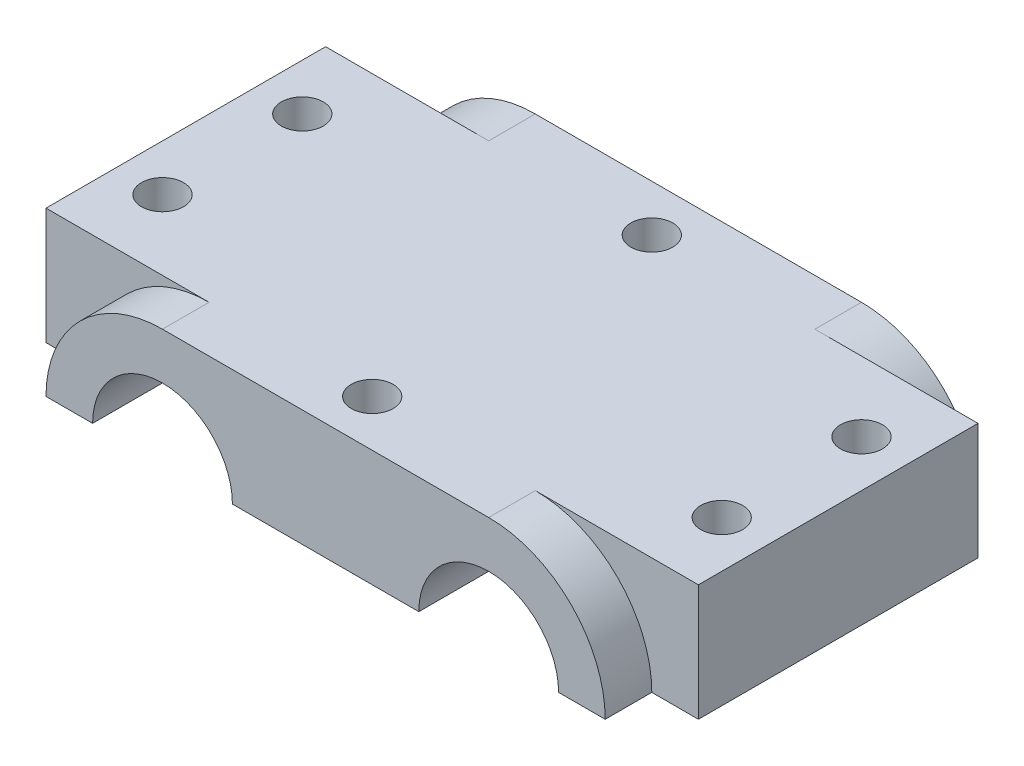
ISO-10303-21;
HEADER;
FILE_DESCRIPTION(('STEP AP214'),'2;1');
FILE_NAME('part.step','',(''),(''),'','','');
FILE_SCHEMA(('AUTOMOTIVE_DESIGN { 1 0 10303 214 1 1 1 1 }'));
ENDSEC;
DATA;
#1=APPLICATION_CONTEXT('core data for automotive mechanical design processes');
#2=APPLICATION_PROTOCOL_DEFINITION('international standard','automotive_design',2000,#1);
#3=PRODUCT_CONTEXT('',#1,'mechanical');
#4=PRODUCT('Part','Part','',(#3));
#5=PRODUCT_RELATED_PRODUCT_CATEGORY('part','',(#4));
#6=PRODUCT_DEFINITION_FORMATION('','',#4);
#7=PRODUCT_DEFINITION_CONTEXT('part definition',#1,'design');
#8=PRODUCT_DEFINITION('design','',#6,#7);
#9=PRODUCT_DEFINITION_SHAPE('','',#8);
#10=(LENGTH_UNIT() NAMED_UNIT(*) SI_UNIT(.MILLI.,.METRE.));
#11=(NAMED_UNIT(*) PLANE_ANGLE_UNIT() SI_UNIT($,.RADIAN.));
#12=(NAMED_UNIT(*) SI_UNIT($,.STERADIAN.) SOLID_ANGLE_UNIT());
#13=UNCERTAINTY_MEASURE_WITH_UNIT(LENGTH_MEASURE(1.E-05),#10,'distance_accuracy_value','');
#14=(GEOMETRIC_REPRESENTATION_CONTEXT(3) GLOBAL_UNCERTAINTY_ASSIGNED_CONTEXT((#13)) GLOBAL_UNIT_ASSIGNED_CONTEXT((#10,
#11,#12)) REPRESENTATION_CONTEXT('',''));
#15=CARTESIAN_POINT('',(0.,0.,0.));
#16=DIRECTION('',(0.,0.,1.));
#17=DIRECTION('',(1.,0.,0.));
#18=AXIS2_PLACEMENT_3D('',#15,#16,#17);
#19=CARTESIAN_POINT('',(0.,0.,15.));
#20=DIRECTION('',(0.,0.,1.));
#21=DIRECTION('',(1.,0.,0.));
#22=AXIS2_PLACEMENT_3D('',#19,#20,#21);
#23=PLANE('',#22);
#24=DIRECTION('',(1.,0.,0.));
#25=VECTOR('',#24,1.);
#26=CARTESIAN_POINT('',(0.,12.5,15.));
#27=LINE('',#26,#25);
#28=CARTESIAN_POINT('',(52.5,12.5,15.));
#29=VERTEX_POINT('',#28);
#30=CARTESIAN_POINT('',(70.,12.5,15.));
#31=VERTEX_POINT('',#30);
#32=EDGE_CURVE('E69',#29,#31,#27,.T.);
#33=ORIENTED_EDGE('',*,*,#32,.F.);
#34=CARTESIAN_POINT('',(52.5,0.,15.));
#35=DIRECTION('',(0.,0.,1.));
#36=DIRECTION('',(1.,0.,0.));
#37=AXIS2_PLACEMENT_3D('',#34,#35,#36);
#38=CIRCLE('',#37,12.5);
#39=CARTESIAN_POINT('',(65.,0.,15.));
#40=VERTEX_POINT('',#39);
#41=EDGE_CURVE('E262',#29,#40,#38,.F.);
#42=ORIENTED_EDGE('',*,*,#41,.T.);
#43=DIRECTION('',(-1.,0.,0.));
#44=VECTOR('',#43,1.);
#45=CARTESIAN_POINT('',(0.,0.,15.));
#46=LINE('',#45,#44);
#47=CARTESIAN_POINT('',(70.,0.,15.));
#48=VERTEX_POINT('',#47);
#49=EDGE_CURVE('E266',#48,#40,#46,.T.);
#50=ORIENTED_EDGE('',*,*,#49,.F.);
#51=DIRECTION('',(0.,1.,0.));
#52=VECTOR('',#51,1.);
#53=CARTESIAN_POINT('',(70.,0.,15.));
#54=LINE('',#53,#52);
#55=EDGE_CURVE('E269',#48,#31,#54,.T.);
#56=ORIENTED_EDGE('',*,*,#55,.T.);
#57=EDGE_LOOP('',(#33,#42,#50,#56));
#58=FACE_BOUND('',#57,.T.);
#59=ADVANCED_FACE('F43',(#58),#23,.T.);
#60=DIRECTION('',(1.,0.,0.));
#61=VECTOR('',#60,1.);
#62=CARTESIAN_POINT('',(0.,0.,15.));
#63=LINE('',#62,#61);
#64=CARTESIAN_POINT('',(0.,0.,15.));
#65=VERTEX_POINT('',#64);
#66=CARTESIAN_POINT('',(5.,0.,15.));
#67=VERTEX_POINT('',#66);
#68=EDGE_CURVE('E61',#65,#67,#63,.T.);
#69=ORIENTED_EDGE('',*,*,#68,.T.);
#70=CARTESIAN_POINT('',(17.5,0.,15.));
#71=DIRECTION('',(0.,0.,1.));
#72=DIRECTION('',(1.,0.,0.));
#73=AXIS2_PLACEMENT_3D('',#70,#71,#72);
#74=CIRCLE('',#73,12.5);
#75=CARTESIAN_POINT('',(17.5,12.5,15.));
#76=VERTEX_POINT('',#75);
#77=EDGE_CURVE('E259',#67,#76,#74,.F.);
#78=ORIENTED_EDGE('',*,*,#77,.T.);
#79=CARTESIAN_POINT('',(0.,12.5,15.));
#80=VERTEX_POINT('',#79);
#81=EDGE_CURVE('E273',#80,#76,#27,.T.);
#82=ORIENTED_EDGE('',*,*,#81,.F.);
#83=DIRECTION('',(0.,1.,0.));
#84=VECTOR('',#83,1.);
#85=CARTESIAN_POINT('',(0.,0.,15.));
#86=LINE('',#85,#84);
#87=EDGE_CURVE('E277',#65,#80,#86,.T.);
#88=ORIENTED_EDGE('',*,*,#87,.F.);
#89=EDGE_LOOP('',(#69,#78,#82,#88));
#90=FACE_BOUND('',#89,.T.);
#91=ADVANCED_FACE('F397',(#90),#23,.T.);
#92=CARTESIAN_POINT('',(0.,0.,-15.));
#93=DIRECTION('',(0.,0.,1.));
#94=DIRECTION('',(1.,0.,0.));
#95=AXIS2_PLACEMENT_3D('',#92,#93,#94);
#96=PLANE('',#95);
#97=CARTESIAN_POINT('',(52.5,0.,-15.));
#98=DIRECTION('',(0.,0.,1.));
#99=DIRECTION('',(1.,0.,0.));
#100=AXIS2_PLACEMENT_3D('',#97,#98,#99);
#101=CIRCLE('',#100,12.5);
#102=CARTESIAN_POINT('',(52.5,12.5,-15.));
#103=VERTEX_POINT('',#102);
#104=CARTESIAN_POINT('',(65.,0.,-15.));
#105=VERTEX_POINT('',#104);
#106=EDGE_CURVE('E11',#103,#105,#101,.F.);
#107=ORIENTED_EDGE('',*,*,#106,.F.);
#108=DIRECTION('',(1.,0.,0.));
#109=VECTOR('',#108,1.);
#110=CARTESIAN_POINT('',(0.,12.5,-15.));
#111=LINE('',#110,#109);
#112=CARTESIAN_POINT('',(70.,12.5,-15.));
#113=VERTEX_POINT('',#112);
#114=EDGE_CURVE('E291',#103,#113,#111,.T.);
#115=ORIENTED_EDGE('',*,*,#114,.T.);
#116=DIRECTION('',(0.,1.,0.));
#117=VECTOR('',#116,1.);
#118=CARTESIAN_POINT('',(70.,0.,-15.));
#119=LINE('',#118,#117);
#120=CARTESIAN_POINT('',(70.,0.,-15.));
#121=VERTEX_POINT('',#120);
#122=EDGE_CURVE('E287',#121,#113,#119,.T.);
#123=ORIENTED_EDGE('',*,*,#122,.F.);
#124=DIRECTION('',(-1.,0.,0.));
#125=VECTOR('',#124,1.);
#126=CARTESIAN_POINT('',(0.,0.,-15.));
#127=LINE('',#126,#125);
#128=EDGE_CURVE('E265',#121,#105,#127,.T.);
#129=ORIENTED_EDGE('',*,*,#128,.T.);
#130=EDGE_LOOP('',(#107,#115,#123,#129));
#131=FACE_BOUND('',#130,.T.);
#132=ADVANCED_FACE('F402',(#131),#96,.F.);
#133=CARTESIAN_POINT('',(17.5,0.,-15.));
#134=DIRECTION('',(0.,0.,1.));
#135=DIRECTION('',(1.,0.,0.));
#136=AXIS2_PLACEMENT_3D('',#133,#134,#135);
#137=CIRCLE('',#136,12.5);
#138=CARTESIAN_POINT('',(5.,0.,-15.));
#139=VERTEX_POINT('',#138);
#140=CARTESIAN_POINT('',(17.5,12.5,-15.));
#141=VERTEX_POINT('',#140);
#142=EDGE_CURVE('E53',#139,#141,#137,.F.);
#143=ORIENTED_EDGE('',*,*,#142,.F.);
#144=DIRECTION('',(1.,0.,0.));
#145=VECTOR('',#144,1.);
#146=CARTESIAN_POINT('',(0.,0.,-15.));
#147=LINE('',#146,#145);
#148=CARTESIAN_POINT('',(0.,0.,-15.));
#149=VERTEX_POINT('',#148);
#150=EDGE_CURVE('E270',#149,#139,#147,.T.);
#151=ORIENTED_EDGE('',*,*,#150,.F.);
#152=DIRECTION('',(0.,1.,0.));
#153=VECTOR('',#152,1.);
#154=CARTESIAN_POINT('',(0.,0.,-15.));
#155=LINE('',#154,#153);
#156=CARTESIAN_POINT('',(0.,12.5,-15.));
#157=VERTEX_POINT('',#156);
#158=EDGE_CURVE('E296',#149,#157,#155,.T.);
#159=ORIENTED_EDGE('',*,*,#158,.T.);
#160=EDGE_CURVE('E292',#157,#141,#111,.T.);
#161=ORIENTED_EDGE('',*,*,#160,.T.);
#162=EDGE_LOOP('',(#143,#151,#159,#161));
#163=FACE_BOUND('',#162,.T.);
#164=ADVANCED_FACE('F409',(#163),#96,.F.);
#165=CARTESIAN_POINT('',(52.5,0.,15.));
#166=DIRECTION('',(0.,0.,-1.));
#167=DIRECTION('',(-1.,0.,0.));
#168=AXIS2_PLACEMENT_3D('',#165,#166,#167);
#169=CYLINDRICAL_SURFACE('',#168,7.5);
#170=DIRECTION('',(0.,0.,-1.));
#171=VECTOR('',#170,1.);
#172=CARTESIAN_POINT('',(45.,0.,15.));
#173=LINE('',#172,#171);
#174=CARTESIAN_POINT('',(45.,0.,20.));
#175=VERTEX_POINT('',#174);
#176=CARTESIAN_POINT('',(45.,0.,-20.));
#177=VERTEX_POINT('',#176);
#178=EDGE_CURVE('E283',#175,#177,#173,.T.);
#179=ORIENTED_EDGE('',*,*,#178,.T.);
#180=CARTESIAN_POINT('',(52.5,0.,-20.));
#181=DIRECTION('',(0.,0.,1.));
#182=DIRECTION('',(1.,0.,0.));
#183=AXIS2_PLACEMENT_3D('',#180,#181,#182);
#184=CIRCLE('',#183,7.5);
#185=CARTESIAN_POINT('',(60.,0.,-20.));
#186=VERTEX_POINT('',#185);
#187=EDGE_CURVE('E163',#186,#177,#184,.T.);
#188=ORIENTED_EDGE('',*,*,#187,.F.);
#189=DIRECTION('',(0.,0.,-1.));
#190=VECTOR('',#189,1.);
#191=CARTESIAN_POINT('',(60.,0.,15.));
#192=LINE('',#191,#190);
#193=CARTESIAN_POINT('',(60.,0.,20.));
#194=VERTEX_POINT('',#193);
#195=EDGE_CURVE('E159',#194,#186,#192,.T.);
#196=ORIENTED_EDGE('',*,*,#195,.F.);
#197=CARTESIAN_POINT('',(52.5,0.,20.));
#198=DIRECTION('',(0.,0.,1.));
#199=DIRECTION('',(1.,0.,0.));
#200=AXIS2_PLACEMENT_3D('',#197,#198,#199);
#201=CIRCLE('',#200,7.5);
#202=EDGE_CURVE('E161',#194,#175,#201,.T.);
#203=ORIENTED_EDGE('',*,*,#202,.T.);
#204=EDGE_LOOP('',(#179,#188,#196,#203));
#205=FACE_BOUND('',#204,.T.);
#206=ADVANCED_FACE('F45',(#205),#169,.F.);
#207=CARTESIAN_POINT('',(0.,0.,15.));
#208=DIRECTION('',(0.,-1.,0.));
#209=DIRECTION('',(0.,0.,-1.));
#210=AXIS2_PLACEMENT_3D('',#207,#208,#209);
#211=PLANE('',#210);
#212=CARTESIAN_POINT('',(65.,0.,7.50000000000001));
#213=DIRECTION('',(0.,1.,0.));
#214=DIRECTION('',(0.,0.,1.));
#215=AXIS2_PLACEMENT_3D('',#212,#213,#214);
#216=CIRCLE('',#215,2.25);
#217=CARTESIAN_POINT('',(65.,0.,9.75));
#218=VERTEX_POINT('',#217);
#219=EDGE_CURVE('E352',#218,#218,#216,.T.);
#220=ORIENTED_EDGE('',*,*,#219,.T.);
#221=EDGE_LOOP('',(#220));
#222=FACE_BOUND('',#221,.T.);
#223=CARTESIAN_POINT('',(65.,0.,-7.50000000000001));
#224=DIRECTION('',(0.,1.,0.));
#225=DIRECTION('',(0.,0.,-1.));
#226=AXIS2_PLACEMENT_3D('',#223,#224,#225);
#227=CIRCLE('',#226,2.25);
#228=CARTESIAN_POINT('',(65.,0.,-9.75));
#229=VERTEX_POINT('',#228);
#230=EDGE_CURVE('E361',#229,#229,#227,.T.);
#231=ORIENTED_EDGE('',*,*,#230,.T.);
#232=EDGE_LOOP('',(#231));
#233=FACE_BOUND('',#232,.T.);
#234=DIRECTION('',(0.,0.,-1.));
#235=VECTOR('',#234,1.);
#236=CARTESIAN_POINT('',(65.,0.,20.));
#237=LINE('',#236,#235);
#238=CARTESIAN_POINT('',(65.,0.,-20.));
#239=VERTEX_POINT('',#238);
#240=EDGE_CURVE('E256',#105,#239,#237,.T.);
#241=ORIENTED_EDGE('',*,*,#240,.F.);
#242=ORIENTED_EDGE('',*,*,#128,.F.);
#243=DIRECTION('',(0.,0.,-1.));
#244=VECTOR('',#243,1.);
#245=CARTESIAN_POINT('',(70.,0.,15.));
#246=LINE('',#245,#244);
#247=EDGE_CURVE('E169',#48,#121,#246,.T.);
#248=ORIENTED_EDGE('',*,*,#247,.F.);
#249=ORIENTED_EDGE('',*,*,#49,.T.);
#250=CARTESIAN_POINT('',(65.,0.,20.));
#251=VERTEX_POINT('',#250);
#252=EDGE_CURVE('E186',#251,#40,#237,.T.);
#253=ORIENTED_EDGE('',*,*,#252,.F.);
#254=DIRECTION('',(-1.,0.,0.));
#255=VECTOR('',#254,1.);
#256=CARTESIAN_POINT('',(0.,0.,20.));
#257=LINE('',#256,#255);
#258=EDGE_CURVE('E175',#251,#194,#257,.T.);
#259=ORIENTED_EDGE('',*,*,#258,.T.);
#260=ORIENTED_EDGE('',*,*,#195,.T.);
#261=DIRECTION('',(-1.,0.,0.));
#262=VECTOR('',#261,1.);
#263=CARTESIAN_POINT('',(0.,0.,-20.));
#264=LINE('',#263,#262);
#265=EDGE_CURVE('E216',#239,#186,#264,.T.);
#266=ORIENTED_EDGE('',*,*,#265,.F.);
#267=EDGE_LOOP('',(#241,#242,#248,#249,#253,#259,#260,#266));
#268=FACE_BOUND('',#267,.T.);
#269=ADVANCED_FACE('F183',(#222,#233,#268),#211,.T.);
#270=CARTESIAN_POINT('',(70.,0.,15.));
#271=DIRECTION('',(-1.,0.,0.));
#272=DIRECTION('',(0.,0.,1.));
#273=AXIS2_PLACEMENT_3D('',#270,#271,#272);
#274=PLANE('',#273);
#275=ORIENTED_EDGE('',*,*,#122,.T.);
#276=DIRECTION('',(0.,0.,-1.));
#277=VECTOR('',#276,1.);
#278=CARTESIAN_POINT('',(70.,12.5,15.));
#279=LINE('',#278,#277);
#280=EDGE_CURVE('E317',#31,#113,#279,.T.);
#281=ORIENTED_EDGE('',*,*,#280,.F.);
#282=ORIENTED_EDGE('',*,*,#55,.F.);
#283=ORIENTED_EDGE('',*,*,#247,.T.);
#284=EDGE_LOOP('',(#275,#281,#282,#283));
#285=FACE_BOUND('',#284,.T.);
#286=ADVANCED_FACE('F429',(#285),#274,.F.);
#287=CARTESIAN_POINT('',(0.,12.5,15.));
#288=DIRECTION('',(0.,1.,0.));
#289=DIRECTION('',(0.,0.,1.));
#290=AXIS2_PLACEMENT_3D('',#287,#288,#289);
#291=PLANE('',#290);
#292=CARTESIAN_POINT('',(35.,12.5,-15.));
#293=DIRECTION('',(0.,1.,0.));
#294=DIRECTION('',(0.,0.,1.));
#295=AXIS2_PLACEMENT_3D('',#292,#293,#294);
#296=CIRCLE('',#295,2.25);
#297=CARTESIAN_POINT('',(35.,12.5,-12.75));
#298=VERTEX_POINT('',#297);
#299=EDGE_CURVE('E341',#298,#298,#296,.T.);
#300=ORIENTED_EDGE('',*,*,#299,.F.);
#301=EDGE_LOOP('',(#300));
#302=FACE_BOUND('',#301,.T.);
#303=CARTESIAN_POINT('',(5.,12.5,7.50000000000001));
#304=DIRECTION('',(0.,1.,0.));
#305=DIRECTION('',(0.,0.,1.));
#306=AXIS2_PLACEMENT_3D('',#303,#304,#305);
#307=CIRCLE('',#306,2.25);
#308=CARTESIAN_POINT('',(5.,12.5,9.75000000000001));
#309=VERTEX_POINT('',#308);
#310=EDGE_CURVE('E327',#309,#309,#307,.T.);
#311=ORIENTED_EDGE('',*,*,#310,.F.);
#312=EDGE_LOOP('',(#311));
#313=FACE_BOUND('',#312,.T.);
#314=CARTESIAN_POINT('',(65.,12.5,7.50000000000001));
#315=DIRECTION('',(0.,1.,0.));
#316=DIRECTION('',(0.,0.,1.));
#317=AXIS2_PLACEMENT_3D('',#314,#315,#316);
#318=CIRCLE('',#317,2.25);
#319=CARTESIAN_POINT('',(65.,12.5,9.75));
#320=VERTEX_POINT('',#319);
#321=EDGE_CURVE('E47',#320,#320,#318,.T.);
#322=ORIENTED_EDGE('',*,*,#321,.F.);
#323=EDGE_LOOP('',(#322));
#324=FACE_BOUND('',#323,.T.);
#325=CARTESIAN_POINT('',(35.,12.5,15.));
#326=DIRECTION('',(0.,1.,0.));
#327=DIRECTION('',(0.,0.,1.));
#328=AXIS2_PLACEMENT_3D('',#325,#326,#327);
#329=CIRCLE('',#328,2.25);
#330=CARTESIAN_POINT('',(35.,12.5,17.25));
#331=VERTEX_POINT('',#330);
#332=EDGE_CURVE('E347',#331,#331,#329,.T.);
#333=ORIENTED_EDGE('',*,*,#332,.F.);
#334=EDGE_LOOP('',(#333));
#335=FACE_BOUND('',#334,.T.);
#336=CARTESIAN_POINT('',(65.,12.5,-7.50000000000001));
#337=DIRECTION('',(0.,1.,0.));
#338=DIRECTION('',(0.,0.,1.));
#339=AXIS2_PLACEMENT_3D('',#336,#337,#338);
#340=CIRCLE('',#339,2.25);
#341=CARTESIAN_POINT('',(65.,12.5,-5.25000000000001));
#342=VERTEX_POINT('',#341);
#343=EDGE_CURVE('E324',#342,#342,#340,.T.);
#344=ORIENTED_EDGE('',*,*,#343,.F.);
#345=EDGE_LOOP('',(#344));
#346=FACE_BOUND('',#345,.T.);
#347=CARTESIAN_POINT('',(5.,12.5,-7.5));
#348=DIRECTION('',(0.,1.,0.));
#349=DIRECTION('',(0.,0.,1.));
#350=AXIS2_PLACEMENT_3D('',#347,#348,#349);
#351=CIRCLE('',#350,2.25);
#352=CARTESIAN_POINT('',(5.,12.5,-5.25));
#353=VERTEX_POINT('',#352);
#354=EDGE_CURVE('E335',#353,#353,#351,.T.);
#355=ORIENTED_EDGE('',*,*,#354,.F.);
#356=EDGE_LOOP('',(#355));
#357=FACE_BOUND('',#356,.T.);
#358=ORIENTED_EDGE('',*,*,#81,.T.);
#359=DIRECTION('',(0.,0.,-1.));
#360=VECTOR('',#359,1.);
#361=CARTESIAN_POINT('',(17.5,12.5,20.));
#362=LINE('',#361,#360);
#363=CARTESIAN_POINT('',(17.5,12.5,20.));
#364=VERTEX_POINT('',#363);
#365=EDGE_CURVE('E247',#364,#76,#362,.T.);
#366=ORIENTED_EDGE('',*,*,#365,.F.);
#367=DIRECTION('',(1.,0.,0.));
#368=VECTOR('',#367,1.);
#369=CARTESIAN_POINT('',(0.,12.5,20.));
#370=LINE('',#369,#368);
#371=CARTESIAN_POINT('',(52.5,12.5,20.));
#372=VERTEX_POINT('',#371);
#373=EDGE_CURVE('E193',#364,#372,#370,.T.);
#374=ORIENTED_EDGE('',*,*,#373,.T.);
#375=DIRECTION('',(0.,0.,-1.));
#376=VECTOR('',#375,1.);
#377=CARTESIAN_POINT('',(52.5,12.5,20.));
#378=LINE('',#377,#376);
#379=EDGE_CURVE('E252',#372,#29,#378,.T.);
#380=ORIENTED_EDGE('',*,*,#379,.T.);
#381=ORIENTED_EDGE('',*,*,#32,.T.);
#382=ORIENTED_EDGE('',*,*,#280,.T.);
#383=ORIENTED_EDGE('',*,*,#114,.F.);
#384=CARTESIAN_POINT('',(52.5,12.5,-20.));
#385=VERTEX_POINT('',#384);
#386=EDGE_CURVE('E251',#103,#385,#378,.T.);
#387=ORIENTED_EDGE('',*,*,#386,.T.);
#388=DIRECTION('',(1.,0.,0.));
#389=VECTOR('',#388,1.);
#390=CARTESIAN_POINT('',(0.,12.5,-20.));
#391=LINE('',#390,#389);
#392=CARTESIAN_POINT('',(17.5,12.5,-20.));
#393=VERTEX_POINT('',#392);
#394=EDGE_CURVE('E223',#393,#385,#391,.T.);
#395=ORIENTED_EDGE('',*,*,#394,.F.);
#396=EDGE_CURVE('E246',#141,#393,#362,.T.);
#397=ORIENTED_EDGE('',*,*,#396,.F.);
#398=ORIENTED_EDGE('',*,*,#160,.F.);
#399=DIRECTION('',(0.,0.,-1.));
#400=VECTOR('',#399,1.);
#401=CARTESIAN_POINT('',(0.,12.5,15.));
#402=LINE('',#401,#400);
#403=EDGE_CURVE('E314',#80,#157,#402,.T.);
#404=ORIENTED_EDGE('',*,*,#403,.F.);
#405=EDGE_LOOP('',(#358,#366,#374,#380,#381,#382,#383,#387,#395,#397,#398,#404));
#406=FACE_BOUND('',#405,.T.);
#407=ADVANCED_FACE('F425',(#302,#313,#324,#335,#346,#357,#406),#291,.T.);
#408=CARTESIAN_POINT('',(0.,0.,15.));
#409=DIRECTION('',(-1.,0.,0.));
#410=DIRECTION('',(0.,0.,1.));
#411=AXIS2_PLACEMENT_3D('',#408,#409,#410);
#412=PLANE('',#411);
#413=ORIENTED_EDGE('',*,*,#158,.F.);
#414=DIRECTION('',(0.,0.,-1.));
#415=VECTOR('',#414,1.);
#416=CARTESIAN_POINT('',(0.,0.,15.));
#417=LINE('',#416,#415);
#418=EDGE_CURVE('E311',#65,#149,#417,.T.);
#419=ORIENTED_EDGE('',*,*,#418,.F.);
#420=ORIENTED_EDGE('',*,*,#87,.T.);
#421=ORIENTED_EDGE('',*,*,#403,.T.);
#422=EDGE_LOOP('',(#413,#419,#420,#421));
#423=FACE_BOUND('',#422,.T.);
#424=ADVANCED_FACE('F421',(#423),#412,.T.);
#425=CARTESIAN_POINT('',(0.,0.,15.));
#426=DIRECTION('',(0.,1.,0.));
#427=DIRECTION('',(0.,0.,1.));
#428=AXIS2_PLACEMENT_3D('',#425,#426,#427);
#429=PLANE('',#428);
#430=CARTESIAN_POINT('',(5.,0.,7.50000000000001));
#431=DIRECTION('',(0.,1.,0.));
#432=DIRECTION('',(0.,0.,-1.));
#433=AXIS2_PLACEMENT_3D('',#430,#431,#432);
#434=CIRCLE('',#433,2.25);
#435=CARTESIAN_POINT('',(5.,0.,5.25));
#436=VERTEX_POINT('',#435);
#437=EDGE_CURVE('E357',#436,#436,#434,.T.);
#438=ORIENTED_EDGE('',*,*,#437,.T.);
#439=EDGE_LOOP('',(#438));
#440=FACE_BOUND('',#439,.T.);
#441=CARTESIAN_POINT('',(5.,0.,-7.5));
#442=DIRECTION('',(0.,1.,0.));
#443=DIRECTION('',(0.,0.,1.));
#444=AXIS2_PLACEMENT_3D('',#441,#442,#443);
#445=CIRCLE('',#444,2.25);
#446=CARTESIAN_POINT('',(5.,0.,-5.25));
#447=VERTEX_POINT('',#446);
#448=EDGE_CURVE('E365',#447,#447,#445,.T.);
#449=ORIENTED_EDGE('',*,*,#448,.T.);
#450=EDGE_LOOP('',(#449));
#451=FACE_BOUND('',#450,.T.);
#452=DIRECTION('',(0.,0.,-1.));
#453=VECTOR('',#452,1.);
#454=CARTESIAN_POINT('',(10.,0.,15.));
#455=LINE('',#454,#453);
#456=CARTESIAN_POINT('',(10.,0.,20.));
#457=VERTEX_POINT('',#456);
#458=CARTESIAN_POINT('',(10.,0.,-20.));
#459=VERTEX_POINT('',#458);
#460=EDGE_CURVE('E308',#457,#459,#455,.T.);
#461=ORIENTED_EDGE('',*,*,#460,.F.);
#462=DIRECTION('',(1.,0.,0.));
#463=VECTOR('',#462,1.);
#464=CARTESIAN_POINT('',(0.,0.,20.));
#465=LINE('',#464,#463);
#466=CARTESIAN_POINT('',(5.,0.,20.));
#467=VERTEX_POINT('',#466);
#468=EDGE_CURVE('E203',#467,#457,#465,.T.);
#469=ORIENTED_EDGE('',*,*,#468,.F.);
#470=DIRECTION('',(0.,0.,-1.));
#471=VECTOR('',#470,1.);
#472=CARTESIAN_POINT('',(5.,0.,20.));
#473=LINE('',#472,#471);
#474=EDGE_CURVE('E242',#467,#67,#473,.T.);
#475=ORIENTED_EDGE('',*,*,#474,.T.);
#476=ORIENTED_EDGE('',*,*,#68,.F.);
#477=ORIENTED_EDGE('',*,*,#418,.T.);
#478=ORIENTED_EDGE('',*,*,#150,.T.);
#479=CARTESIAN_POINT('',(5.,0.,-20.));
#480=VERTEX_POINT('',#479);
#481=EDGE_CURVE('E213',#139,#480,#473,.T.);
#482=ORIENTED_EDGE('',*,*,#481,.T.);
#483=DIRECTION('',(1.,0.,0.));
#484=VECTOR('',#483,1.);
#485=CARTESIAN_POINT('',(0.,0.,-20.));
#486=LINE('',#485,#484);
#487=EDGE_CURVE('E231',#480,#459,#486,.T.);
#488=ORIENTED_EDGE('',*,*,#487,.T.);
#489=EDGE_LOOP('',(#461,#469,#475,#476,#477,#478,#482,#488));
#490=FACE_BOUND('',#489,.T.);
#491=ADVANCED_FACE('F417',(#440,#451,#490),#429,.F.);
#492=CARTESIAN_POINT('',(17.5,0.,15.));
#493=DIRECTION('',(0.,0.,-1.));
#494=DIRECTION('',(-1.,0.,0.));
#495=AXIS2_PLACEMENT_3D('',#492,#493,#494);
#496=CYLINDRICAL_SURFACE('',#495,7.5);
#497=ORIENTED_EDGE('',*,*,#460,.T.);
#498=CARTESIAN_POINT('',(17.5,0.,-20.));
#499=DIRECTION('',(0.,0.,1.));
#500=DIRECTION('',(1.,0.,0.));
#501=AXIS2_PLACEMENT_3D('',#498,#499,#500);
#502=CIRCLE('',#501,7.5);
#503=CARTESIAN_POINT('',(25.,0.,-20.));
#504=VERTEX_POINT('',#503);
#505=EDGE_CURVE('E235',#504,#459,#502,.T.);
#506=ORIENTED_EDGE('',*,*,#505,.F.);
#507=DIRECTION('',(0.,0.,-1.));
#508=VECTOR('',#507,1.);
#509=CARTESIAN_POINT('',(25.,0.,15.));
#510=LINE('',#509,#508);
#511=CARTESIAN_POINT('',(25.,0.,20.));
#512=VERTEX_POINT('',#511);
#513=EDGE_CURVE('E305',#512,#504,#510,.T.);
#514=ORIENTED_EDGE('',*,*,#513,.F.);
#515=CARTESIAN_POINT('',(17.5,0.,20.));
#516=DIRECTION('',(0.,0.,1.));
#517=DIRECTION('',(1.,0.,0.));
#518=AXIS2_PLACEMENT_3D('',#515,#516,#517);
#519=CIRCLE('',#518,7.5);
#520=EDGE_CURVE('E207',#512,#457,#519,.T.);
#521=ORIENTED_EDGE('',*,*,#520,.T.);
#522=EDGE_LOOP('',(#497,#506,#514,#521));
#523=FACE_BOUND('',#522,.T.);
#524=ADVANCED_FACE('F414',(#523),#496,.F.);
#525=CARTESIAN_POINT('',(0.,0.,15.));
#526=DIRECTION('',(0.,1.,0.));
#527=DIRECTION('',(0.,0.,1.));
#528=AXIS2_PLACEMENT_3D('',#525,#526,#527);
#529=PLANE('',#528);
#530=CARTESIAN_POINT('',(35.,0.,-15.));
#531=DIRECTION('',(0.,1.,0.));
#532=DIRECTION('',(0.,0.,1.));
#533=AXIS2_PLACEMENT_3D('',#530,#531,#532);
#534=CIRCLE('',#533,2.25);
#535=CARTESIAN_POINT('',(35.,0.,-12.75));
#536=VERTEX_POINT('',#535);
#537=EDGE_CURVE('E351',#536,#536,#534,.T.);
#538=ORIENTED_EDGE('',*,*,#537,.T.);
#539=EDGE_LOOP('',(#538));
#540=FACE_BOUND('',#539,.T.);
#541=CARTESIAN_POINT('',(35.,0.,15.));
#542=DIRECTION('',(0.,1.,0.));
#543=DIRECTION('',(0.,0.,-1.));
#544=AXIS2_PLACEMENT_3D('',#541,#542,#543);
#545=CIRCLE('',#544,2.25);
#546=CARTESIAN_POINT('',(35.,0.,12.75));
#547=VERTEX_POINT('',#546);
#548=EDGE_CURVE('E356',#547,#547,#545,.T.);
#549=ORIENTED_EDGE('',*,*,#548,.T.);
#550=EDGE_LOOP('',(#549));
#551=FACE_BOUND('',#550,.T.);
#552=ORIENTED_EDGE('',*,*,#513,.T.);
#553=DIRECTION('',(1.,0.,0.));
#554=VECTOR('',#553,1.);
#555=CARTESIAN_POINT('',(0.,0.,-20.));
#556=LINE('',#555,#554);
#557=EDGE_CURVE('E180',#504,#177,#556,.T.);
#558=ORIENTED_EDGE('',*,*,#557,.T.);
#559=ORIENTED_EDGE('',*,*,#178,.F.);
#560=DIRECTION('',(1.,0.,0.));
#561=VECTOR('',#560,1.);
#562=CARTESIAN_POINT('',(0.,0.,20.));
#563=LINE('',#562,#561);
#564=EDGE_CURVE('E178',#512,#175,#563,.T.);
#565=ORIENTED_EDGE('',*,*,#564,.F.);
#566=EDGE_LOOP('',(#552,#558,#559,#565));
#567=FACE_BOUND('',#566,.T.);
#568=ADVANCED_FACE('F377',(#540,#551,#567),#529,.F.);
#569=CARTESIAN_POINT('',(0.,0.,-20.));
#570=DIRECTION('',(0.,0.,1.));
#571=DIRECTION('',(1.,0.,0.));
#572=AXIS2_PLACEMENT_3D('',#569,#570,#571);
#573=PLANE('',#572);
#574=ORIENTED_EDGE('',*,*,#187,.T.);
#575=ORIENTED_EDGE('',*,*,#557,.F.);
#576=ORIENTED_EDGE('',*,*,#505,.T.);
#577=ORIENTED_EDGE('',*,*,#487,.F.);
#578=CARTESIAN_POINT('',(17.5,0.,-20.));
#579=DIRECTION('',(0.,0.,1.));
#580=DIRECTION('',(1.,0.,0.));
#581=AXIS2_PLACEMENT_3D('',#578,#579,#580);
#582=CIRCLE('',#581,12.5);
#583=EDGE_CURVE('E227',#393,#480,#582,.T.);
#584=ORIENTED_EDGE('',*,*,#583,.F.);
#585=ORIENTED_EDGE('',*,*,#394,.T.);
#586=CARTESIAN_POINT('',(52.5,0.,-20.));
#587=DIRECTION('',(0.,0.,1.));
#588=DIRECTION('',(1.,0.,0.));
#589=AXIS2_PLACEMENT_3D('',#586,#587,#588);
#590=CIRCLE('',#589,12.5);
#591=EDGE_CURVE('E219',#239,#385,#590,.T.);
#592=ORIENTED_EDGE('',*,*,#591,.F.);
#593=ORIENTED_EDGE('',*,*,#265,.T.);
#594=EDGE_LOOP('',(#574,#575,#576,#577,#584,#585,#592,#593));
#595=FACE_BOUND('',#594,.T.);
#596=ADVANCED_FACE('F413',(#595),#573,.F.);
#597=CARTESIAN_POINT('',(17.5,0.,20.));
#598=DIRECTION('',(0.,0.,-1.));
#599=DIRECTION('',(-1.,0.,0.));
#600=AXIS2_PLACEMENT_3D('',#597,#598,#599);
#601=CYLINDRICAL_SURFACE('',#600,12.5);
#602=ORIENTED_EDGE('',*,*,#481,.F.);
#603=ORIENTED_EDGE('',*,*,#142,.T.);
#604=ORIENTED_EDGE('',*,*,#396,.T.);
#605=ORIENTED_EDGE('',*,*,#583,.T.);
#606=EDGE_LOOP('',(#602,#603,#604,#605));
#607=FACE_BOUND('',#606,.T.);
#608=ADVANCED_FACE('F457',(#607),#601,.T.);
#609=CARTESIAN_POINT('',(52.5,0.,20.));
#610=DIRECTION('',(0.,0.,-1.));
#611=DIRECTION('',(-1.,0.,0.));
#612=AXIS2_PLACEMENT_3D('',#609,#610,#611);
#613=CYLINDRICAL_SURFACE('',#612,12.5);
#614=ORIENTED_EDGE('',*,*,#386,.F.);
#615=ORIENTED_EDGE('',*,*,#106,.T.);
#616=ORIENTED_EDGE('',*,*,#240,.T.);
#617=ORIENTED_EDGE('',*,*,#591,.T.);
#618=EDGE_LOOP('',(#614,#615,#616,#617));
#619=FACE_BOUND('',#618,.T.);
#620=ADVANCED_FACE('F464',(#619),#613,.T.);
#621=ORIENTED_EDGE('',*,*,#41,.F.);
#622=ORIENTED_EDGE('',*,*,#379,.F.);
#623=CARTESIAN_POINT('',(52.5,0.,20.));
#624=DIRECTION('',(0.,0.,1.));
#625=DIRECTION('',(1.,0.,0.));
#626=AXIS2_PLACEMENT_3D('',#623,#624,#625);
#627=CIRCLE('',#626,12.5);
#628=EDGE_CURVE('E189',#251,#372,#627,.T.);
#629=ORIENTED_EDGE('',*,*,#628,.F.);
#630=ORIENTED_EDGE('',*,*,#252,.T.);
#631=EDGE_LOOP('',(#621,#622,#629,#630));
#632=FACE_BOUND('',#631,.T.);
#633=ADVANCED_FACE('F405',(#632),#613,.T.);
#634=ORIENTED_EDGE('',*,*,#77,.F.);
#635=ORIENTED_EDGE('',*,*,#474,.F.);
#636=CARTESIAN_POINT('',(17.5,0.,20.));
#637=DIRECTION('',(0.,0.,1.));
#638=DIRECTION('',(1.,0.,0.));
#639=AXIS2_PLACEMENT_3D('',#636,#637,#638);
#640=CIRCLE('',#639,12.5);
#641=EDGE_CURVE('E200',#364,#467,#640,.T.);
#642=ORIENTED_EDGE('',*,*,#641,.F.);
#643=ORIENTED_EDGE('',*,*,#365,.T.);
#644=EDGE_LOOP('',(#634,#635,#642,#643));
#645=FACE_BOUND('',#644,.T.);
#646=ADVANCED_FACE('F455',(#645),#601,.T.);
#647=CARTESIAN_POINT('',(0.,0.,20.));
#648=DIRECTION('',(0.,0.,1.));
#649=DIRECTION('',(1.,0.,0.));
#650=AXIS2_PLACEMENT_3D('',#647,#648,#649);
#651=PLANE('',#650);
#652=ORIENTED_EDGE('',*,*,#202,.F.);
#653=ORIENTED_EDGE('',*,*,#258,.F.);
#654=ORIENTED_EDGE('',*,*,#628,.T.);
#655=ORIENTED_EDGE('',*,*,#373,.F.);
#656=ORIENTED_EDGE('',*,*,#641,.T.);
#657=ORIENTED_EDGE('',*,*,#468,.T.);
#658=ORIENTED_EDGE('',*,*,#520,.F.);
#659=ORIENTED_EDGE('',*,*,#564,.T.);
#660=EDGE_LOOP('',(#652,#653,#654,#655,#656,#657,#658,#659));
#661=FACE_BOUND('',#660,.T.);
#662=ADVANCED_FACE('F174',(#661),#651,.T.);
#663=CARTESIAN_POINT('',(35.,0.,15.));
#664=DIRECTION('',(0.,1.,0.));
#665=DIRECTION('',(0.,0.,1.));
#666=AXIS2_PLACEMENT_3D('',#663,#664,#665);
#667=CYLINDRICAL_SURFACE('',#666,2.25);
#668=ORIENTED_EDGE('',*,*,#332,.T.);
#669=EDGE_LOOP('',(#668));
#670=FACE_BOUND('',#669,.T.);
#671=ORIENTED_EDGE('',*,*,#548,.F.);
#672=EDGE_LOOP('',(#671));
#673=FACE_BOUND('',#672,.T.);
#674=ADVANCED_FACE('F383',(#670,#673),#667,.F.);
#675=CARTESIAN_POINT('',(35.,0.,-15.));
#676=DIRECTION('',(0.,1.,0.));
#677=DIRECTION('',(0.,0.,1.));
#678=AXIS2_PLACEMENT_3D('',#675,#676,#677);
#679=CYLINDRICAL_SURFACE('',#678,2.25);
#680=ORIENTED_EDGE('',*,*,#299,.T.);
#681=EDGE_LOOP('',(#680));
#682=FACE_BOUND('',#681,.T.);
#683=ORIENTED_EDGE('',*,*,#537,.F.);
#684=EDGE_LOOP('',(#683));
#685=FACE_BOUND('',#684,.T.);
#686=ADVANCED_FACE('F380',(#682,#685),#679,.F.);
#687=CARTESIAN_POINT('',(5.,0.,-7.5));
#688=DIRECTION('',(0.,1.,0.));
#689=DIRECTION('',(0.,0.,1.));
#690=AXIS2_PLACEMENT_3D('',#687,#688,#689);
#691=CYLINDRICAL_SURFACE('',#690,2.25);
#692=ORIENTED_EDGE('',*,*,#354,.T.);
#693=EDGE_LOOP('',(#692));
#694=FACE_BOUND('',#693,.T.);
#695=ORIENTED_EDGE('',*,*,#448,.F.);
#696=EDGE_LOOP('',(#695));
#697=FACE_BOUND('',#696,.T.);
#698=ADVANCED_FACE('F382',(#694,#697),#691,.F.);
#699=CARTESIAN_POINT('',(5.,0.,7.50000000000001));
#700=DIRECTION('',(0.,1.,0.));
#701=DIRECTION('',(0.,0.,1.));
#702=AXIS2_PLACEMENT_3D('',#699,#700,#701);
#703=CYLINDRICAL_SURFACE('',#702,2.25);
#704=ORIENTED_EDGE('',*,*,#310,.T.);
#705=EDGE_LOOP('',(#704));
#706=FACE_BOUND('',#705,.T.);
#707=ORIENTED_EDGE('',*,*,#437,.F.);
#708=EDGE_LOOP('',(#707));
#709=FACE_BOUND('',#708,.T.);
#710=ADVANCED_FACE('F390',(#706,#709),#703,.F.);
#711=CARTESIAN_POINT('',(65.,0.,-7.50000000000001));
#712=DIRECTION('',(0.,1.,0.));
#713=DIRECTION('',(0.,0.,1.));
#714=AXIS2_PLACEMENT_3D('',#711,#712,#713);
#715=CYLINDRICAL_SURFACE('',#714,2.25);
#716=ORIENTED_EDGE('',*,*,#343,.T.);
#717=EDGE_LOOP('',(#716));
#718=FACE_BOUND('',#717,.T.);
#719=ORIENTED_EDGE('',*,*,#230,.F.);
#720=EDGE_LOOP('',(#719));
#721=FACE_BOUND('',#720,.T.);
#722=ADVANCED_FACE('F442',(#718,#721),#715,.F.);
#723=CARTESIAN_POINT('',(65.,0.,7.50000000000001));
#724=DIRECTION('',(0.,1.,0.));
#725=DIRECTION('',(0.,0.,1.));
#726=AXIS2_PLACEMENT_3D('',#723,#724,#725);
#727=CYLINDRICAL_SURFACE('',#726,2.25);
#728=ORIENTED_EDGE('',*,*,#321,.T.);
#729=EDGE_LOOP('',(#728));
#730=FACE_BOUND('',#729,.T.);
#731=ORIENTED_EDGE('',*,*,#219,.F.);
#732=EDGE_LOOP('',(#731));
#733=FACE_BOUND('',#732,.T.);
#734=ADVANCED_FACE('F444',(#730,#733),#727,.F.);
#735=CLOSED_SHELL('',(#59,#91,#132,#164,#206,#269,#286,#407,#424,#491,#524,#568,#596,#608,#620,
#633,#646,#662,#674,#686,#698,#710,#722,#734));
#736=MANIFOLD_SOLID_BREP('B2',#735);
#737=ADVANCED_BREP_SHAPE_REPRESENTATION('',(#18,#736),#14);
#738=SHAPE_DEFINITION_REPRESENTATION(#9,#737);
ENDSEC;
END-ISO-10303-21;
